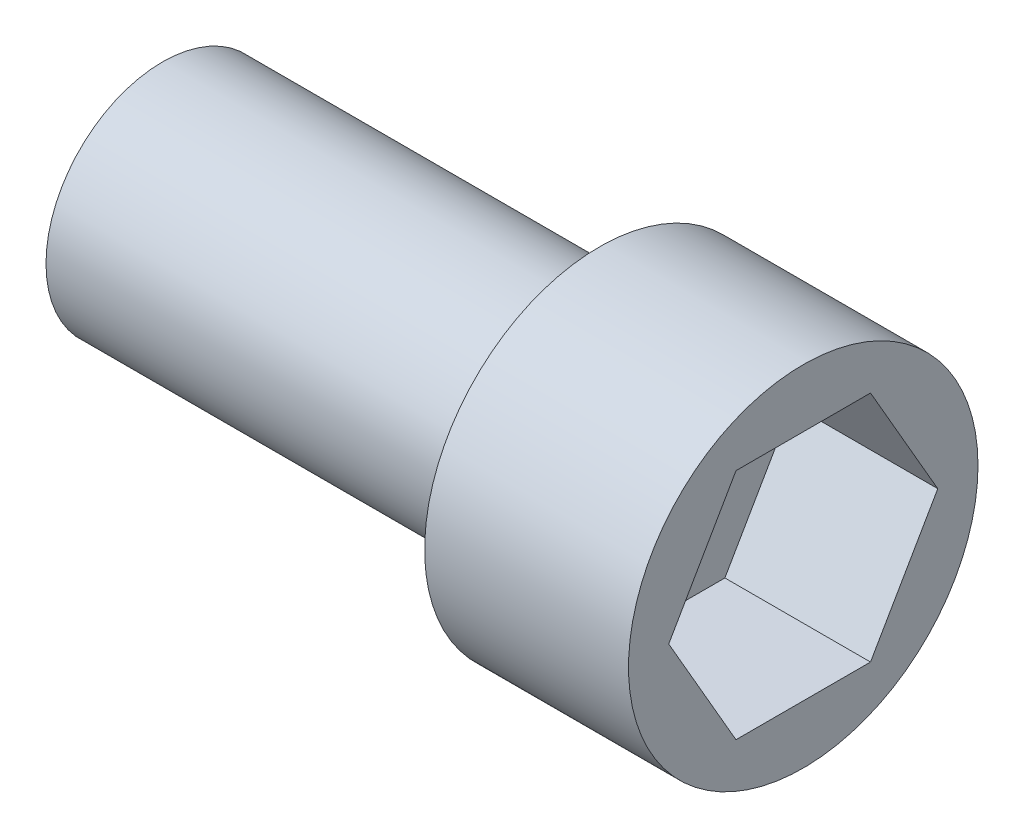
ISO-10303-21;
HEADER;
FILE_DESCRIPTION(('STEP AP214'),'2;1');
FILE_NAME('part.step','',(''),(''),'','','');
FILE_SCHEMA(('AUTOMOTIVE_DESIGN { 1 0 10303 214 1 1 1 1 }'));
ENDSEC;
DATA;
#1=APPLICATION_CONTEXT('core data for automotive mechanical design processes');
#2=APPLICATION_PROTOCOL_DEFINITION('international standard','automotive_design',2000,#1);
#3=PRODUCT_CONTEXT('',#1,'mechanical');
#4=PRODUCT('Part','Part','',(#3));
#5=PRODUCT_RELATED_PRODUCT_CATEGORY('part','',(#4));
#6=PRODUCT_DEFINITION_FORMATION('','',#4);
#7=PRODUCT_DEFINITION_CONTEXT('part definition',#1,'design');
#8=PRODUCT_DEFINITION('design','',#6,#7);
#9=PRODUCT_DEFINITION_SHAPE('','',#8);
#10=(LENGTH_UNIT() NAMED_UNIT(*) SI_UNIT(.MILLI.,.METRE.));
#11=(NAMED_UNIT(*) PLANE_ANGLE_UNIT() SI_UNIT($,.RADIAN.));
#12=(NAMED_UNIT(*) SI_UNIT($,.STERADIAN.) SOLID_ANGLE_UNIT());
#13=UNCERTAINTY_MEASURE_WITH_UNIT(LENGTH_MEASURE(1.E-05),#10,'distance_accuracy_value','');
#14=(GEOMETRIC_REPRESENTATION_CONTEXT(3) GLOBAL_UNCERTAINTY_ASSIGNED_CONTEXT((#13)) GLOBAL_UNIT_ASSIGNED_CONTEXT((#10,
#11,#12)) REPRESENTATION_CONTEXT('',''));
#15=CARTESIAN_POINT('',(0.,0.,0.));
#16=DIRECTION('',(0.,0.,1.));
#17=DIRECTION('',(1.,0.,0.));
#18=AXIS2_PLACEMENT_3D('',#15,#16,#17);
#19=CARTESIAN_POINT('',(0.,0.,0.));
#20=DIRECTION('',(-1.,0.,0.));
#21=DIRECTION('',(0.,0.,1.));
#22=AXIS2_PLACEMENT_3D('',#19,#20,#21);
#23=PLANE('',#22);
#24=CARTESIAN_POINT('',(0.,0.,0.));
#25=DIRECTION('',(1.,0.,0.));
#26=DIRECTION('',(0.,0.,-1.));
#27=AXIS2_PLACEMENT_3D('',#24,#25,#26);
#28=CIRCLE('',#27,4.);
#29=CARTESIAN_POINT('',(0.,0.,-4.));
#30=VERTEX_POINT('',#29);
#31=EDGE_CURVE('E11',#30,#30,#28,.T.);
#32=ORIENTED_EDGE('',*,*,#31,.F.);
#33=EDGE_LOOP('',(#32));
#34=FACE_BOUND('',#33,.T.);
#35=ADVANCED_FACE('F41',(#34),#23,.T.);
#36=CARTESIAN_POINT('',(22.,0.,0.));
#37=DIRECTION('',(1.,0.,0.));
#38=DIRECTION('',(0.,0.,-1.));
#39=AXIS2_PLACEMENT_3D('',#36,#37,#38);
#40=CYLINDRICAL_SURFACE('',#39,4.);
#41=ORIENTED_EDGE('',*,*,#31,.T.);
#42=EDGE_LOOP('',(#41));
#43=FACE_BOUND('',#42,.T.);
#44=CARTESIAN_POINT('',(15.,0.,0.));
#45=DIRECTION('',(1.,0.,0.));
#46=DIRECTION('',(0.,0.,-1.));
#47=AXIS2_PLACEMENT_3D('',#44,#45,#46);
#48=CIRCLE('',#47,4.);
#49=CARTESIAN_POINT('',(15.,0.,-4.));
#50=VERTEX_POINT('',#49);
#51=EDGE_CURVE('E48',#50,#50,#48,.T.);
#52=ORIENTED_EDGE('',*,*,#51,.F.);
#53=EDGE_LOOP('',(#52));
#54=FACE_BOUND('',#53,.T.);
#55=ADVANCED_FACE('F156',(#43,#54),#40,.T.);
#56=CARTESIAN_POINT('',(15.,4.,0.));
#57=DIRECTION('',(-1.,0.,0.));
#58=DIRECTION('',(0.,0.,1.));
#59=AXIS2_PLACEMENT_3D('',#56,#57,#58);
#60=PLANE('',#59);
#61=ORIENTED_EDGE('',*,*,#51,.T.);
#62=EDGE_LOOP('',(#61));
#63=FACE_BOUND('',#62,.T.);
#64=CARTESIAN_POINT('',(15.,0.,0.));
#65=DIRECTION('',(1.,0.,0.));
#66=DIRECTION('',(0.,0.,-1.));
#67=AXIS2_PLACEMENT_3D('',#64,#65,#66);
#68=CIRCLE('',#67,6.);
#69=CARTESIAN_POINT('',(15.,0.,-6.));
#70=VERTEX_POINT('',#69);
#71=EDGE_CURVE('E148',#70,#70,#68,.T.);
#72=ORIENTED_EDGE('',*,*,#71,.F.);
#73=EDGE_LOOP('',(#72));
#74=FACE_BOUND('',#73,.T.);
#75=ADVANCED_FACE('F151',(#63,#74),#60,.T.);
#76=CARTESIAN_POINT('',(22.,0.,0.));
#77=DIRECTION('',(1.,0.,0.));
#78=DIRECTION('',(0.,0.,-1.));
#79=AXIS2_PLACEMENT_3D('',#76,#77,#78);
#80=CYLINDRICAL_SURFACE('',#79,6.);
#81=ORIENTED_EDGE('',*,*,#71,.T.);
#82=EDGE_LOOP('',(#81));
#83=FACE_BOUND('',#82,.T.);
#84=CARTESIAN_POINT('',(22.,0.,0.));
#85=DIRECTION('',(1.,0.,0.));
#86=DIRECTION('',(0.,0.,-1.));
#87=AXIS2_PLACEMENT_3D('',#84,#85,#86);
#88=CIRCLE('',#87,6.);
#89=CARTESIAN_POINT('',(22.,0.,-6.));
#90=VERTEX_POINT('',#89);
#91=EDGE_CURVE('E145',#90,#90,#88,.T.);
#92=ORIENTED_EDGE('',*,*,#91,.F.);
#93=EDGE_LOOP('',(#92));
#94=FACE_BOUND('',#93,.T.);
#95=ADVANCED_FACE('F161',(#83,#94),#80,.T.);
#96=CARTESIAN_POINT('',(22.,6.,0.));
#97=DIRECTION('',(1.,0.,0.));
#98=DIRECTION('',(0.,0.,-1.));
#99=AXIS2_PLACEMENT_3D('',#96,#97,#98);
#100=PLANE('',#99);
#101=DIRECTION('',(0.,0.866025403784439,-0.5));
#102=VECTOR('',#101,1.);
#103=CARTESIAN_POINT('',(22.,-4.,-2.3094010767585));
#104=LINE('',#103,#102);
#105=CARTESIAN_POINT('',(22.,-4.,-2.3094010767585));
#106=VERTEX_POINT('',#105);
#107=CARTESIAN_POINT('',(22.,0.,-4.61880215351701));
#108=VERTEX_POINT('',#107);
#109=EDGE_CURVE('E54',#106,#108,#104,.T.);
#110=ORIENTED_EDGE('',*,*,#109,.F.);
#111=DIRECTION('',(0.,0.,-1.));
#112=VECTOR('',#111,1.);
#113=CARTESIAN_POINT('',(22.,-4.,2.3094010767585));
#114=LINE('',#113,#112);
#115=CARTESIAN_POINT('',(22.,-4.,2.3094010767585));
#116=VERTEX_POINT('',#115);
#117=EDGE_CURVE('E138',#116,#106,#114,.T.);
#118=ORIENTED_EDGE('',*,*,#117,.F.);
#119=DIRECTION('',(0.,-0.866025403784439,-0.5));
#120=VECTOR('',#119,1.);
#121=CARTESIAN_POINT('',(22.,0.,4.61880215351701));
#122=LINE('',#121,#120);
#123=CARTESIAN_POINT('',(22.,0.,4.61880215351701));
#124=VERTEX_POINT('',#123);
#125=EDGE_CURVE('E136',#124,#116,#122,.T.);
#126=ORIENTED_EDGE('',*,*,#125,.F.);
#127=DIRECTION('',(0.,-0.866025403784439,0.5));
#128=VECTOR('',#127,1.);
#129=CARTESIAN_POINT('',(22.,4.,2.3094010767585));
#130=LINE('',#129,#128);
#131=CARTESIAN_POINT('',(22.,4.,2.3094010767585));
#132=VERTEX_POINT('',#131);
#133=EDGE_CURVE('E104',#132,#124,#130,.T.);
#134=ORIENTED_EDGE('',*,*,#133,.F.);
#135=DIRECTION('',(0.,0.,1.));
#136=VECTOR('',#135,1.);
#137=CARTESIAN_POINT('',(22.,4.,-2.3094010767585));
#138=LINE('',#137,#136);
#139=CARTESIAN_POINT('',(22.,4.,-2.3094010767585));
#140=VERTEX_POINT('',#139);
#141=EDGE_CURVE('E135',#140,#132,#138,.T.);
#142=ORIENTED_EDGE('',*,*,#141,.F.);
#143=DIRECTION('',(0.,0.866025403784438,0.5));
#144=VECTOR('',#143,1.);
#145=CARTESIAN_POINT('',(22.,0.,-4.61880215351701));
#146=LINE('',#145,#144);
#147=EDGE_CURVE('E129',#108,#140,#146,.T.);
#148=ORIENTED_EDGE('',*,*,#147,.F.);
#149=EDGE_LOOP('',(#110,#118,#126,#134,#142,#148));
#150=FACE_BOUND('',#149,.T.);
#151=ORIENTED_EDGE('',*,*,#91,.T.);
#152=EDGE_LOOP('',(#151));
#153=FACE_BOUND('',#152,.T.);
#154=ADVANCED_FACE('F173',(#150,#153),#100,.T.);
#155=CARTESIAN_POINT('',(17.,-4.,-2.3094010767585));
#156=DIRECTION('',(0.,-0.5,-0.866025403784439));
#157=DIRECTION('',(0.,0.866025403784439,-0.5));
#158=AXIS2_PLACEMENT_3D('',#155,#156,#157);
#159=PLANE('',#158);
#160=ORIENTED_EDGE('',*,*,#109,.T.);
#161=DIRECTION('',(1.,0.,0.));
#162=VECTOR('',#161,1.);
#163=CARTESIAN_POINT('',(17.,0.,-4.61880215351701));
#164=LINE('',#163,#162);
#165=CARTESIAN_POINT('',(17.,0.,-4.61880215351701));
#166=VERTEX_POINT('',#165);
#167=EDGE_CURVE('E82',#166,#108,#164,.T.);
#168=ORIENTED_EDGE('',*,*,#167,.F.);
#169=DIRECTION('',(0.,0.866025403784439,-0.5));
#170=VECTOR('',#169,1.);
#171=CARTESIAN_POINT('',(17.,-4.,-2.3094010767585));
#172=LINE('',#171,#170);
#173=CARTESIAN_POINT('',(17.,-4.,-2.3094010767585));
#174=VERTEX_POINT('',#173);
#175=EDGE_CURVE('E139',#174,#166,#172,.T.);
#176=ORIENTED_EDGE('',*,*,#175,.F.);
#177=DIRECTION('',(1.,0.,0.));
#178=VECTOR('',#177,1.);
#179=CARTESIAN_POINT('',(17.,-4.,-2.3094010767585));
#180=LINE('',#179,#178);
#181=EDGE_CURVE('E63',#174,#106,#180,.T.);
#182=ORIENTED_EDGE('',*,*,#181,.T.);
#183=EDGE_LOOP('',(#160,#168,#176,#182));
#184=FACE_BOUND('',#183,.T.);
#185=ADVANCED_FACE('F172',(#184),#159,.F.);
#186=CARTESIAN_POINT('',(17.,-4.,2.3094010767585));
#187=DIRECTION('',(0.,-1.,0.));
#188=DIRECTION('',(0.,0.,-1.));
#189=AXIS2_PLACEMENT_3D('',#186,#187,#188);
#190=PLANE('',#189);
#191=ORIENTED_EDGE('',*,*,#117,.T.);
#192=ORIENTED_EDGE('',*,*,#181,.F.);
#193=DIRECTION('',(0.,0.,-1.));
#194=VECTOR('',#193,1.);
#195=CARTESIAN_POINT('',(17.,-4.,2.3094010767585));
#196=LINE('',#195,#194);
#197=CARTESIAN_POINT('',(17.,-4.,2.3094010767585));
#198=VERTEX_POINT('',#197);
#199=EDGE_CURVE('E113',#198,#174,#196,.T.);
#200=ORIENTED_EDGE('',*,*,#199,.F.);
#201=DIRECTION('',(1.,0.,0.));
#202=VECTOR('',#201,1.);
#203=CARTESIAN_POINT('',(17.,-4.,2.3094010767585));
#204=LINE('',#203,#202);
#205=EDGE_CURVE('E110',#198,#116,#204,.T.);
#206=ORIENTED_EDGE('',*,*,#205,.T.);
#207=EDGE_LOOP('',(#191,#192,#200,#206));
#208=FACE_BOUND('',#207,.T.);
#209=ADVANCED_FACE('F177',(#208),#190,.F.);
#210=CARTESIAN_POINT('',(17.,0.,4.61880215351701));
#211=DIRECTION('',(0.,-0.5,0.866025403784439));
#212=DIRECTION('',(0.,-0.866025403784439,-0.5));
#213=AXIS2_PLACEMENT_3D('',#210,#211,#212);
#214=PLANE('',#213);
#215=ORIENTED_EDGE('',*,*,#125,.T.);
#216=ORIENTED_EDGE('',*,*,#205,.F.);
#217=DIRECTION('',(0.,-0.866025403784439,-0.5));
#218=VECTOR('',#217,1.);
#219=CARTESIAN_POINT('',(17.,0.,4.61880215351701));
#220=LINE('',#219,#218);
#221=CARTESIAN_POINT('',(17.,0.,4.61880215351701));
#222=VERTEX_POINT('',#221);
#223=EDGE_CURVE('E112',#222,#198,#220,.T.);
#224=ORIENTED_EDGE('',*,*,#223,.F.);
#225=DIRECTION('',(1.,0.,0.));
#226=VECTOR('',#225,1.);
#227=CARTESIAN_POINT('',(17.,0.,4.61880215351701));
#228=LINE('',#227,#226);
#229=EDGE_CURVE('E96',#222,#124,#228,.T.);
#230=ORIENTED_EDGE('',*,*,#229,.T.);
#231=EDGE_LOOP('',(#215,#216,#224,#230));
#232=FACE_BOUND('',#231,.T.);
#233=ADVANCED_FACE('F115',(#232),#214,.F.);
#234=CARTESIAN_POINT('',(17.,4.,2.3094010767585));
#235=DIRECTION('',(0.,0.5,0.866025403784439));
#236=DIRECTION('',(0.,-0.866025403784439,0.5));
#237=AXIS2_PLACEMENT_3D('',#234,#235,#236);
#238=PLANE('',#237);
#239=ORIENTED_EDGE('',*,*,#133,.T.);
#240=ORIENTED_EDGE('',*,*,#229,.F.);
#241=DIRECTION('',(0.,-0.866025403784439,0.5));
#242=VECTOR('',#241,1.);
#243=CARTESIAN_POINT('',(17.,4.,2.3094010767585));
#244=LINE('',#243,#242);
#245=CARTESIAN_POINT('',(17.,4.,2.3094010767585));
#246=VERTEX_POINT('',#245);
#247=EDGE_CURVE('E99',#246,#222,#244,.T.);
#248=ORIENTED_EDGE('',*,*,#247,.F.);
#249=DIRECTION('',(1.,0.,0.));
#250=VECTOR('',#249,1.);
#251=CARTESIAN_POINT('',(17.,4.,2.3094010767585));
#252=LINE('',#251,#250);
#253=EDGE_CURVE('E108',#246,#132,#252,.T.);
#254=ORIENTED_EDGE('',*,*,#253,.T.);
#255=EDGE_LOOP('',(#239,#240,#248,#254));
#256=FACE_BOUND('',#255,.T.);
#257=ADVANCED_FACE('F97',(#256),#238,.F.);
#258=CARTESIAN_POINT('',(17.,4.,-2.3094010767585));
#259=DIRECTION('',(0.,1.,0.));
#260=DIRECTION('',(0.,0.,1.));
#261=AXIS2_PLACEMENT_3D('',#258,#259,#260);
#262=PLANE('',#261);
#263=ORIENTED_EDGE('',*,*,#141,.T.);
#264=ORIENTED_EDGE('',*,*,#253,.F.);
#265=DIRECTION('',(0.,0.,1.));
#266=VECTOR('',#265,1.);
#267=CARTESIAN_POINT('',(17.,4.,-2.3094010767585));
#268=LINE('',#267,#266);
#269=CARTESIAN_POINT('',(17.,4.,-2.3094010767585));
#270=VERTEX_POINT('',#269);
#271=EDGE_CURVE('E123',#270,#246,#268,.T.);
#272=ORIENTED_EDGE('',*,*,#271,.F.);
#273=DIRECTION('',(1.,0.,0.));
#274=VECTOR('',#273,1.);
#275=CARTESIAN_POINT('',(17.,4.,-2.3094010767585));
#276=LINE('',#275,#274);
#277=EDGE_CURVE('E144',#270,#140,#276,.T.);
#278=ORIENTED_EDGE('',*,*,#277,.T.);
#279=EDGE_LOOP('',(#263,#264,#272,#278));
#280=FACE_BOUND('',#279,.T.);
#281=ADVANCED_FACE('F183',(#280),#262,.F.);
#282=CARTESIAN_POINT('',(17.,0.,-4.61880215351701));
#283=DIRECTION('',(0.,0.5,-0.866025403784439));
#284=DIRECTION('',(0.,0.866025403784439,0.5));
#285=AXIS2_PLACEMENT_3D('',#282,#283,#284);
#286=PLANE('',#285);
#287=ORIENTED_EDGE('',*,*,#147,.T.);
#288=ORIENTED_EDGE('',*,*,#277,.F.);
#289=DIRECTION('',(0.,0.866025403784438,0.5));
#290=VECTOR('',#289,1.);
#291=CARTESIAN_POINT('',(17.,0.,-4.61880215351701));
#292=LINE('',#291,#290);
#293=EDGE_CURVE('E121',#166,#270,#292,.T.);
#294=ORIENTED_EDGE('',*,*,#293,.F.);
#295=ORIENTED_EDGE('',*,*,#167,.T.);
#296=EDGE_LOOP('',(#287,#288,#294,#295));
#297=FACE_BOUND('',#296,.T.);
#298=ADVANCED_FACE('F179',(#297),#286,.F.);
#299=CARTESIAN_POINT('',(17.,0.,0.));
#300=DIRECTION('',(1.,0.,0.));
#301=DIRECTION('',(0.,0.,-1.));
#302=AXIS2_PLACEMENT_3D('',#299,#300,#301);
#303=PLANE('',#302);
#304=ORIENTED_EDGE('',*,*,#175,.T.);
#305=ORIENTED_EDGE('',*,*,#293,.T.);
#306=ORIENTED_EDGE('',*,*,#271,.T.);
#307=ORIENTED_EDGE('',*,*,#247,.T.);
#308=ORIENTED_EDGE('',*,*,#223,.T.);
#309=ORIENTED_EDGE('',*,*,#199,.T.);
#310=EDGE_LOOP('',(#304,#305,#306,#307,#308,#309));
#311=FACE_BOUND('',#310,.T.);
#312=ADVANCED_FACE('F118',(#311),#303,.T.);
#313=CLOSED_SHELL('',(#35,#55,#75,#95,#154,#185,#209,#233,#257,#281,#298,#312));
#314=MANIFOLD_SOLID_BREP('B2',#313);
#315=ADVANCED_BREP_SHAPE_REPRESENTATION('',(#18,#314),#14);
#316=SHAPE_DEFINITION_REPRESENTATION(#9,#315);
ENDSEC;
END-ISO-10303-21;
